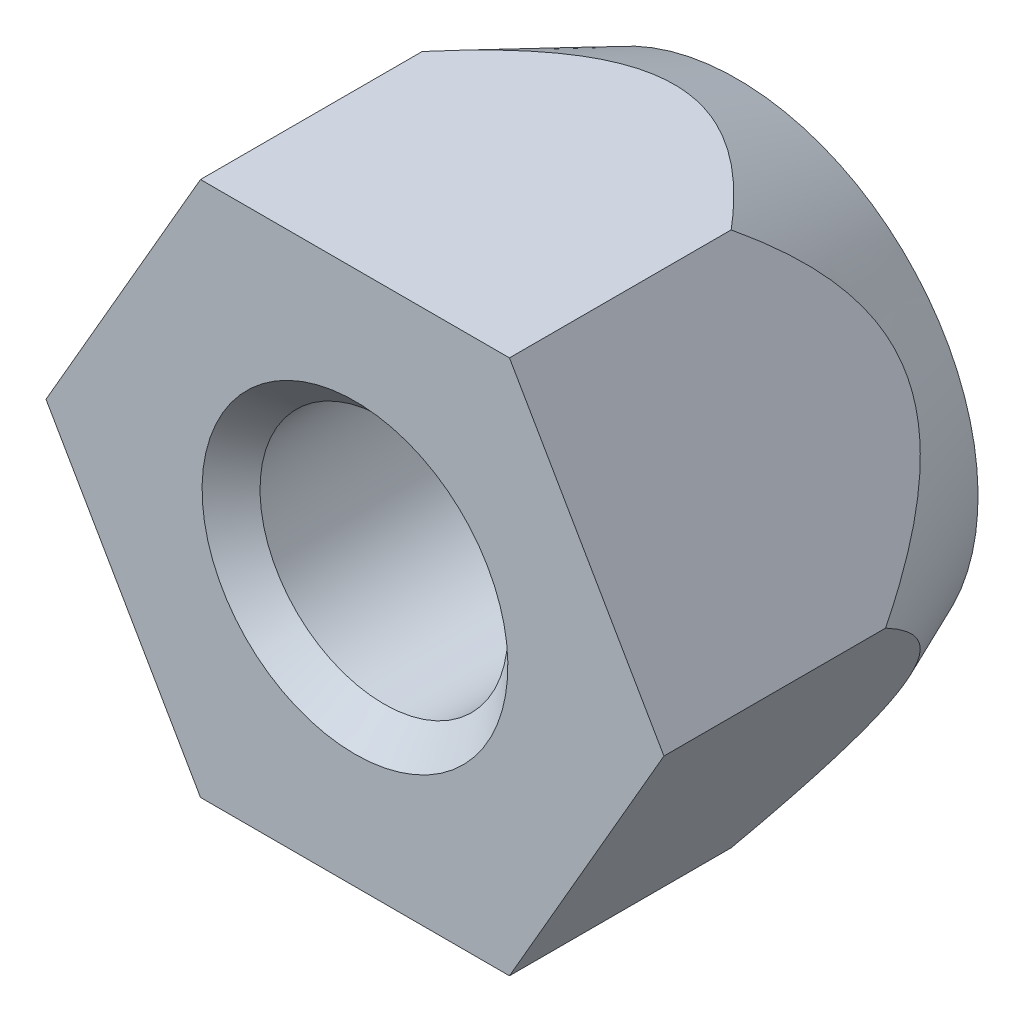
ISO-10303-21;
HEADER;
FILE_DESCRIPTION(('STEP AP214'),'2;1');
FILE_NAME('part.step','',(''),(''),'','','');
FILE_SCHEMA(('AUTOMOTIVE_DESIGN { 1 0 10303 214 1 1 1 1 }'));
ENDSEC;
DATA;
#1=APPLICATION_CONTEXT('core data for automotive mechanical design processes');
#2=APPLICATION_PROTOCOL_DEFINITION('international standard','automotive_design',2000,#1);
#3=PRODUCT_CONTEXT('',#1,'mechanical');
#4=PRODUCT('Part','Part','',(#3));
#5=PRODUCT_RELATED_PRODUCT_CATEGORY('part','',(#4));
#6=PRODUCT_DEFINITION_FORMATION('','',#4);
#7=PRODUCT_DEFINITION_CONTEXT('part definition',#1,'design');
#8=PRODUCT_DEFINITION('design','',#6,#7);
#9=PRODUCT_DEFINITION_SHAPE('','',#8);
#10=(LENGTH_UNIT() NAMED_UNIT(*) SI_UNIT(.MILLI.,.METRE.));
#11=(NAMED_UNIT(*) PLANE_ANGLE_UNIT() SI_UNIT($,.RADIAN.));
#12=(NAMED_UNIT(*) SI_UNIT($,.STERADIAN.) SOLID_ANGLE_UNIT());
#13=UNCERTAINTY_MEASURE_WITH_UNIT(LENGTH_MEASURE(1.E-05),#10,'distance_accuracy_value','');
#14=(GEOMETRIC_REPRESENTATION_CONTEXT(3) GLOBAL_UNCERTAINTY_ASSIGNED_CONTEXT((#13)) GLOBAL_UNIT_ASSIGNED_CONTEXT((#10,
#11,#12)) REPRESENTATION_CONTEXT('',''));
#15=CARTESIAN_POINT('',(0.,0.,0.));
#16=DIRECTION('',(0.,0.,1.));
#17=DIRECTION('',(1.,0.,0.));
#18=AXIS2_PLACEMENT_3D('',#15,#16,#17);
#19=CARTESIAN_POINT('',(2.020725,3.49999836812462,-5.));
#20=DIRECTION('',(-0.866025403784439,-0.5,0.));
#21=DIRECTION('',(-0.5,0.866025403784439,0.));
#22=AXIS2_PLACEMENT_3D('',#19,#20,#21);
#23=PLANE('',#22);
#24=CARTESIAN_POINT('',(2.02072415100027,3.49999983863529,-2.899998));
#25=CARTESIAN_POINT('',(2.04010619505648,3.46642915357538,-2.94565089198604));
#26=CARTESIAN_POINT('',(2.05972797870926,3.43244322735365,-2.99089538058564));
#27=CARTESIAN_POINT('',(2.09951636817217,3.36352771525255,-3.08043964962772));
#28=CARTESIAN_POINT('',(2.11968313958112,3.32859784254763,-3.12473913543784));
#29=CARTESIAN_POINT('',(2.18137903690977,3.22173741375586,-3.25662355142427));
#30=CARTESIAN_POINT('',(2.22382314177766,3.14822206764289,-3.3425250256382));
#31=CARTESIAN_POINT('',(2.31330340280759,2.99323770926453,-3.51108520230281));
#32=CARTESIAN_POINT('',(2.36045082518846,2.91157597825494,-3.59350980490269));
#33=CARTESIAN_POINT('',(2.45859776555435,2.74158049093379,-3.74825957928697));
#34=CARTESIAN_POINT('',(2.50958390481558,2.65326990725155,-3.82061753334812));
#35=CARTESIAN_POINT('',(2.58413071638398,2.52415104207282,-3.91138418798489));
#36=CARTESIAN_POINT('',(2.60577625263011,2.48665987353746,-3.93609856688412));
#37=CARTESIAN_POINT('',(2.64981771669924,2.41037782013,-3.98269921637913));
#38=CARTESIAN_POINT('',(2.67221375542195,2.37158674317399,-4.0045850666697));
#39=CARTESIAN_POINT('',(2.74021351541638,2.25380770396115,-4.06500160353191));
#40=CARTESIAN_POINT('',(2.78694805159032,2.17286111283971,-4.09869381707458));
#41=CARTESIAN_POINT('',(2.88351529794901,2.00560173579945,-4.14936341287786));
#42=CARTESIAN_POINT('',(2.93338565991639,1.9192237350801,-4.16606423215886));
#43=CARTESIAN_POINT('',(3.03382015506977,1.74526608664191,-4.17887532034338));
#44=CARTESIAN_POINT('',(3.0843842045817,1.65768658385082,-4.17498805122023));
#45=CARTESIAN_POINT('',(3.17672793087558,1.49774255814958,-4.14943762280108));
#46=CARTESIAN_POINT('',(3.21870698878445,1.42503269699754,-4.13046928708339));
#47=CARTESIAN_POINT('',(3.30079246575235,1.28285648032561,-4.0803675458512));
#48=CARTESIAN_POINT('',(3.34089735341767,1.21339277725744,-4.04922438028727));
#49=CARTESIAN_POINT('',(3.44767850687831,1.0284423941728,-3.9509167235984));
#50=CARTESIAN_POINT('',(3.51210926451756,0.91684504837146,-3.87413418471944));
#51=CARTESIAN_POINT('',(3.63499410872855,0.704002254717838,-3.7028033845824));
#52=CARTESIAN_POINT('',(3.69340829146907,0.602825922328652,-3.60814700557825));
#53=CARTESIAN_POINT('',(3.80217299392707,0.414439931601275,-3.41354195449901));
#54=CARTESIAN_POINT('',(3.85279151026634,0.326766089497905,-3.31418254961249));
#55=CARTESIAN_POINT('',(3.92575467101574,0.200390187999127,-3.16105796289514));
#56=CARTESIAN_POINT('',(3.94941263836739,0.159413386542265,-3.10974088500592));
#57=CARTESIAN_POINT('',(3.99597160075937,0.0787708981316793,-3.00579847017844));
#58=CARTESIAN_POINT('',(4.01887299253085,0.0391045240194299,-2.95317384509459));
#59=CARTESIAN_POINT('',(4.04145084899974,-1.47051067209862E-06,-2.899998));
#60=B_SPLINE_CURVE_WITH_KNOTS('',3,(#24,#25,#26,#27,#28,#29,#30,#31,#32,#33,#34,#35,#36,#37,#38,
#39,#40,#41,#42,#43,#44,#45,#46,#47,#48,#49,#50,#51,#52,#53,#54,#55,#56,#57,#58,#59),
.UNSPECIFIED.,.F.,.F.,(4,2,2,2,2,2,2,2,2,2,2,2,2,2,2,2,2,4),(0.,0.179663069809123,
0.35938135949057,0.721435633443099,1.09675416599678,1.47082032659827,1.62027619569909,
1.76975424772307,2.06646500543711,2.36793148056737,2.66936190642242,2.92651762715291,
3.18387992295865,3.63127257170363,4.08146358882315,4.50655577753209,4.71594032950862,
4.92521328355732),.UNSPECIFIED.);
#61=CARTESIAN_POINT('',(2.020725,3.49999836812462,-2.9));
#62=VERTEX_POINT('',#61);
#63=CARTESIAN_POINT('',(4.04145,0.,-2.9));
#64=VERTEX_POINT('',#63);
#65=EDGE_CURVE('E84',#62,#64,#60,.T.);
#66=ORIENTED_EDGE('',*,*,#65,.F.);
#67=DIRECTION('',(0.,0.,1.));
#68=VECTOR('',#67,1.);
#69=CARTESIAN_POINT('',(2.020725,3.49999836812462,-5.));
#70=LINE('',#69,#68);
#71=CARTESIAN_POINT('',(2.020725,3.49999836812462,0.));
#72=VERTEX_POINT('',#71);
#73=EDGE_CURVE('E69',#62,#72,#70,.T.);
#74=ORIENTED_EDGE('',*,*,#73,.T.);
#75=DIRECTION('',(0.5,-0.866025403784438,0.));
#76=VECTOR('',#75,1.);
#77=CARTESIAN_POINT('',(2.020725,3.49999836812462,0.));
#78=LINE('',#77,#76);
#79=CARTESIAN_POINT('',(4.04145,0.,0.));
#80=VERTEX_POINT('',#79);
#81=EDGE_CURVE('E87',#72,#80,#78,.T.);
#82=ORIENTED_EDGE('',*,*,#81,.T.);
#83=DIRECTION('',(0.,0.,1.));
#84=VECTOR('',#83,1.);
#85=CARTESIAN_POINT('',(4.04145,0.,-5.));
#86=LINE('',#85,#84);
#87=EDGE_CURVE('E11',#64,#80,#86,.T.);
#88=ORIENTED_EDGE('',*,*,#87,.F.);
#89=EDGE_LOOP('',(#66,#74,#82,#88));
#90=FACE_BOUND('',#89,.T.);
#91=ADVANCED_FACE('F16',(#90),#23,.F.);
#92=CARTESIAN_POINT('',(4.04145,0.,-5.));
#93=DIRECTION('',(-0.866025403784439,0.5,0.));
#94=DIRECTION('',(0.5,0.866025403784439,0.));
#95=AXIS2_PLACEMENT_3D('',#92,#93,#94);
#96=PLANE('',#95);
#97=CARTESIAN_POINT('',(4.04145084899974,1.47051067182888E-06,-2.899998));
#98=CARTESIAN_POINT('',(4.02206880494352,-0.033569214549235,-2.94565089198604));
#99=CARTESIAN_POINT('',(4.00244702129074,-0.0675551407709681,-2.99089538058564));
#100=CARTESIAN_POINT('',(3.96265863182783,-0.13647065287207,-3.08043964962772));
#101=CARTESIAN_POINT('',(3.94249186041888,-0.171400525576984,-3.12473913543784));
#102=CARTESIAN_POINT('',(3.88079596309024,-0.278260954368758,-3.25662355142427));
#103=CARTESIAN_POINT('',(3.83835185822234,-0.351776300481728,-3.3425250256382));
#104=CARTESIAN_POINT('',(3.74887159719242,-0.506760658860088,-3.5110852023028));
#105=CARTESIAN_POINT('',(3.70172417481154,-0.588422389869676,-3.59350980490269));
#106=CARTESIAN_POINT('',(3.60357723444565,-0.758417877190831,-3.74825957928697));
#107=CARTESIAN_POINT('',(3.55259109518442,-0.846728460873068,-3.82061753334811));
#108=CARTESIAN_POINT('',(3.47804428361602,-0.975847326051797,-3.91138418798489));
#109=CARTESIAN_POINT('',(3.45639874736989,-1.01333849458716,-3.93609856688411));
#110=CARTESIAN_POINT('',(3.41235728330076,-1.08962054799462,-3.98269921637913));
#111=CARTESIAN_POINT('',(3.38996124457805,-1.12841162495063,-4.0045850666697));
#112=CARTESIAN_POINT('',(3.32196148458362,-1.24619066416347,-4.06500160353191));
#113=CARTESIAN_POINT('',(3.27522694840968,-1.32713725528491,-4.09869381707458));
#114=CARTESIAN_POINT('',(3.17865970205099,-1.49439663232517,-4.14936341287786));
#115=CARTESIAN_POINT('',(3.12878934008361,-1.58077463304453,-4.16606423215886));
#116=CARTESIAN_POINT('',(3.02835484493023,-1.75473228148271,-4.17887532034337));
#117=CARTESIAN_POINT('',(2.97779079541831,-1.8423117842738,-4.17498805122022));
#118=CARTESIAN_POINT('',(2.88544706912442,-2.00225580997504,-4.14943762280108));
#119=CARTESIAN_POINT('',(2.84346801121555,-2.07496567112708,-4.13046928708339));
#120=CARTESIAN_POINT('',(2.76138253424765,-2.21714188779901,-4.0803675458512));
#121=CARTESIAN_POINT('',(2.72127764658233,-2.28660559086719,-4.04922438028727));
#122=CARTESIAN_POINT('',(2.61449649312169,-2.47155597395182,-3.9509167235984));
#123=CARTESIAN_POINT('',(2.55006573548244,-2.58315331975316,-3.87413418471944));
#124=CARTESIAN_POINT('',(2.42718089127145,-2.79599611340678,-3.7028033845824));
#125=CARTESIAN_POINT('',(2.36876670853093,-2.89717244579597,-3.60814700557825));
#126=CARTESIAN_POINT('',(2.26000200607293,-3.08555843652335,-3.413541954499));
#127=CARTESIAN_POINT('',(2.20938348973366,-3.17323227862672,-3.31418254961249));
#128=CARTESIAN_POINT('',(2.13642032898426,-3.29960818012549,-3.16105796289513));
#129=CARTESIAN_POINT('',(2.11276236163261,-3.34058498158236,-3.10974088500591));
#130=CARTESIAN_POINT('',(2.06620339924064,-3.42122746999294,-3.00579847017844));
#131=CARTESIAN_POINT('',(2.04330200746915,-3.46089384410519,-2.95317384509459));
#132=CARTESIAN_POINT('',(2.02072415100027,-3.49999983863529,-2.899998));
#133=B_SPLINE_CURVE_WITH_KNOTS('',3,(#97,#98,#99,#100,#101,#102,#103,#104,#105,#106,#107,#108,
#109,#110,#111,#112,#113,#114,#115,#116,#117,#118,#119,#120,#121,#122,#123,#124,#125,#126,#127,
#128,#129,#130,#131,#132),.UNSPECIFIED.,.F.,.F.,(4,2,2,2,2,2,2,2,2,2,2,2,2,2,2,2,2,4),(0.,
0.179663069809122,0.359381359490568,0.721435633443094,1.09675416599677,1.47082032659826,
1.62027619569909,1.76975424772307,2.06646500543711,2.36793148056737,2.66936190642242,
2.92651762715291,3.18387992295865,3.63127257170363,4.08146358882316,4.50655577753209,
4.71594032950862,4.92521328355731),.UNSPECIFIED.);
#134=CARTESIAN_POINT('',(2.020725,-3.49999836812462,-2.9));
#135=VERTEX_POINT('',#134);
#136=EDGE_CURVE('E31',#64,#135,#133,.T.);
#137=ORIENTED_EDGE('',*,*,#136,.F.);
#138=ORIENTED_EDGE('',*,*,#87,.T.);
#139=DIRECTION('',(-0.5,-0.866025403784439,0.));
#140=VECTOR('',#139,1.);
#141=CARTESIAN_POINT('',(4.04145,0.,0.));
#142=LINE('',#141,#140);
#143=CARTESIAN_POINT('',(2.020725,-3.49999836812462,0.));
#144=VERTEX_POINT('',#143);
#145=EDGE_CURVE('E299',#80,#144,#142,.T.);
#146=ORIENTED_EDGE('',*,*,#145,.T.);
#147=DIRECTION('',(0.,0.,1.));
#148=VECTOR('',#147,1.);
#149=CARTESIAN_POINT('',(2.020725,-3.49999836812462,-5.));
#150=LINE('',#149,#148);
#151=EDGE_CURVE('E25',#135,#144,#150,.T.);
#152=ORIENTED_EDGE('',*,*,#151,.F.);
#153=EDGE_LOOP('',(#137,#138,#146,#152));
#154=FACE_BOUND('',#153,.T.);
#155=ADVANCED_FACE('F152',(#154),#96,.F.);
#156=CARTESIAN_POINT('',(2.020725,-3.49999836812462,-5.));
#157=DIRECTION('',(0.,1.,0.));
#158=DIRECTION('',(1.,0.,0.));
#159=AXIS2_PLACEMENT_3D('',#156,#157,#158);
#160=PLANE('',#159);
#161=CARTESIAN_POINT('',(-3.60368526524227,-3.49999836812462,-0.586341765384487));
#162=CARTESIAN_POINT('',(-3.53187011337455,-3.49999836812462,-0.707671007586551));
#163=CARTESIAN_POINT('',(-3.45930512100524,-3.49999836812462,-0.828563242155586));
#164=CARTESIAN_POINT('',(-3.31235058980913,-3.49999836812462,-1.0692758727666));
#165=CARTESIAN_POINT('',(-3.23796057927049,-3.49999836812462,-1.18909598053858));
#166=CARTESIAN_POINT('',(-3.08628396302446,-3.49999836812462,-1.42864169720031));
#167=CARTESIAN_POINT('',(-3.00897528326545,-3.49999836812462,-1.54835337221099));
#168=CARTESIAN_POINT('',(-2.85178904394115,-3.49999836812462,-1.78606201635112));
#169=CARTESIAN_POINT('',(-2.77191179701828,-3.49999836812462,-1.9040591916477));
#170=CARTESIAN_POINT('',(-2.60287228799337,-3.49999836812462,-2.14675103457604));
#171=CARTESIAN_POINT('',(-2.51346505080088,-3.49999836812462,-2.27127586614559));
#172=CARTESIAN_POINT('',(-2.33016750965945,-3.49999836812462,-2.51697643964741));
#173=CARTESIAN_POINT('',(-2.23627790694638,-3.49999836812462,-2.63815270078827));
#174=CARTESIAN_POINT('',(-2.04320133293011,-3.49999836812462,-2.87538165544638));
#175=CARTESIAN_POINT('',(-1.94403858894009,-3.49999836812462,-2.99145394720864));
#176=CARTESIAN_POINT('',(-1.73846289891875,-3.49999836812462,-3.21694004890755));
#177=CARTESIAN_POINT('',(-1.63205684142847,-3.49999836812462,-3.3263600028976));
#178=CARTESIAN_POINT('',(-1.46743226257282,-3.49999836812462,-3.480894093348));
#179=CARTESIAN_POINT('',(-1.4128729663633,-3.49999836812462,-3.52990400877336));
#180=CARTESIAN_POINT('',(-1.30120959285346,-3.49999836812462,-3.62500160684067));
#181=CARTESIAN_POINT('',(-1.24410452421649,-3.49999836812462,-3.67108813387286));
#182=CARTESIAN_POINT('',(-1.12747539014198,-3.49999836812462,-3.75923350088157));
#183=CARTESIAN_POINT('',(-1.0679713424504,-3.49999836812462,-3.80131857681453));
#184=CARTESIAN_POINT('',(-0.945936136039932,-3.49999836812462,-3.88080225842855));
#185=CARTESIAN_POINT('',(-0.883406457103035,-3.49999836812462,-3.91820312358852));
#186=CARTESIAN_POINT('',(-0.733695889558256,-3.49999836812462,-3.99857848370267));
#187=CARTESIAN_POINT('',(-0.645243338631821,-3.49999836812462,-4.03925785736186));
#188=CARTESIAN_POINT('',(-0.46304537990612,-3.49999836812462,-4.1063494028999));
#189=CARTESIAN_POINT('',(-0.369306884608134,-3.49999836812462,-4.13277975147609));
#190=CARTESIAN_POINT('',(-0.177364649800885,-3.49999836812462,-4.16801952991906));
#191=CARTESIAN_POINT('',(-0.0791233994873151,-3.49999836812462,-4.176633926494));
#192=CARTESIAN_POINT('',(0.117089626236598,-3.49999836812462,-4.17413239831532));
#193=CARTESIAN_POINT('',(0.215061401328386,-3.49999836812462,-4.16301645024786));
#194=CARTESIAN_POINT('',(0.414073332498433,-3.49999836812462,-4.12153407679946));
#195=CARTESIAN_POINT('',(0.514825219562708,-3.49999836812462,-4.08983715525037));
#196=CARTESIAN_POINT('',(0.709924351166737,-3.49999836812462,-4.01067455757774));
#197=CARTESIAN_POINT('',(0.804257066515896,-3.49999836812462,-3.96317445468344));
#198=CARTESIAN_POINT('',(0.975268221233125,-3.49999836812462,-3.863346961346));
#199=CARTESIAN_POINT('',(1.05270629201837,-3.49999836812462,-3.81228444121548));
#200=CARTESIAN_POINT('',(1.20297308465852,-3.49999836812462,-3.7037169597727));
#201=CARTESIAN_POINT('',(1.27579768520735,-3.49999836812462,-3.64620636181361));
#202=CARTESIAN_POINT('',(1.41803135877625,-3.49999836812462,-3.5258912132412));
#203=CARTESIAN_POINT('',(1.48740320181263,-3.49999836812462,-3.46304314440494));
#204=CARTESIAN_POINT('',(1.6225958566662,-3.49999836812462,-3.33373383579426));
#205=CARTESIAN_POINT('',(1.68841851117596,-3.49999836812462,-3.26727450763575));
#206=CARTESIAN_POINT('',(1.81700595547463,-3.49999836812462,-3.13163620785443));
#207=CARTESIAN_POINT('',(1.87977450495097,-3.49999836812462,-3.06246077975415));
#208=CARTESIAN_POINT('',(2.00279018813071,-3.49999836812462,-2.92189708639954));
#209=CARTESIAN_POINT('',(2.06303695646089,-3.49999836812462,-2.85050850307813));
#210=CARTESIAN_POINT('',(2.24063099376073,-3.49999836812462,-2.63361809244465));
#211=CARTESIAN_POINT('',(2.35475333849329,-3.49999836812462,-2.48547681041738));
#212=CARTESIAN_POINT('',(2.57698061887582,-3.49999836812462,-2.18396024625559));
#213=CARTESIAN_POINT('',(2.68506150861361,-3.49999836812462,-2.03056749443956));
#214=CARTESIAN_POINT('',(2.89626535994594,-3.49999836812462,-1.72039071423693));
#215=CARTESIAN_POINT('',(2.99938768028773,-3.49999836812462,-1.56360625100796));
#216=CARTESIAN_POINT('',(3.19328398781423,-3.49999836812462,-1.26071939303122));
#217=CARTESIAN_POINT('',(3.28437072229164,-3.49999836812462,-1.11481609600272));
#218=CARTESIAN_POINT('',(3.46386325248297,-3.49999836812462,-0.821351061873757));
#219=CARTESIAN_POINT('',(3.5522687535352,-3.49999836812462,-0.673789144919471));
#220=CARTESIAN_POINT('',(3.7260836217544,-3.49999836812462,-0.378658774351413));
#221=CARTESIAN_POINT('',(3.81151249076131,-3.49999836812462,-0.231101772932865));
#222=CARTESIAN_POINT('',(3.98049352146154,-3.49999836812462,0.0650422170049673));
#223=CARTESIAN_POINT('',(4.06404607918504,-3.49999836812462,0.213628979343102));
#224=CARTESIAN_POINT('',(4.14683525622261,-3.49999836812462,0.362634088527305));
#225=B_SPLINE_CURVE_WITH_KNOTS('',3,(#161,#162,#163,#164,#165,#166,#167,#168,#169,#170,#171,
#172,#173,#174,#175,#176,#177,#178,#179,#180,#181,#182,#183,#184,#185,#186,#187,#188,#189,#190,
#191,#192,#193,#194,#195,#196,#197,#198,#199,#200,#201,#202,#203,#204,#205,#206,#207,#208,#209,
#210,#211,#212,#213,#214,#215,#216,#217,#218,#219,#220,#221,#222,#223,#224),.UNSPECIFIED.,.F.,
.F.,(4,2,2,2,2,2,2,2,2,2,2,2,2,2,2,2,2,2,2,2,2,2,2,2,2,2,2,2,2,2,2,4),(0.,0.422976271321654,
0.846063045608591,1.27354850699133,1.70098213093986,2.16079751984572,2.62054120796517,
3.07832965681675,3.53568866293405,3.7556275635951,3.9756528707344,4.19411843727798,
4.41247821541922,4.70359464689231,4.99433883312471,5.28824933629446,5.58216018675596,
5.89726737249627,6.21306555463387,6.49093693682409,6.7690531450872,7.04970713497514,
7.3302139814798,7.61036629536475,7.89055906015058,8.45129183713974,9.01411722522584,
9.57701520440341,10.0929872032773,10.6090157023741,11.1205096010261,11.6318945049628),.UNSPECIFIED.);
#226=CARTESIAN_POINT('',(-2.020725,-3.49999836812462,-2.9));
#227=VERTEX_POINT('',#226);
#228=EDGE_CURVE('E39',#135,#227,#225,.F.);
#229=ORIENTED_EDGE('',*,*,#228,.F.);
#230=ORIENTED_EDGE('',*,*,#151,.T.);
#231=DIRECTION('',(-1.,0.,0.));
#232=VECTOR('',#231,1.);
#233=CARTESIAN_POINT('',(2.020725,-3.49999836812462,0.));
#234=LINE('',#233,#232);
#235=CARTESIAN_POINT('',(-2.020725,-3.49999836812462,0.));
#236=VERTEX_POINT('',#235);
#237=EDGE_CURVE('E315',#144,#236,#234,.T.);
#238=ORIENTED_EDGE('',*,*,#237,.T.);
#239=DIRECTION('',(0.,0.,1.));
#240=VECTOR('',#239,1.);
#241=CARTESIAN_POINT('',(-2.020725,-3.49999836812462,-5.));
#242=LINE('',#241,#240);
#243=EDGE_CURVE('E306',#227,#236,#242,.T.);
#244=ORIENTED_EDGE('',*,*,#243,.F.);
#245=EDGE_LOOP('',(#229,#230,#238,#244));
#246=FACE_BOUND('',#245,.T.);
#247=ADVANCED_FACE('F155',(#246),#160,.F.);
#248=CARTESIAN_POINT('',(-2.020725,-3.49999836812462,-5.));
#249=DIRECTION('',(0.866025403784439,0.5,0.));
#250=DIRECTION('',(0.5,-0.866025403784439,0.));
#251=AXIS2_PLACEMENT_3D('',#248,#249,#250);
#252=PLANE('',#251);
#253=CARTESIAN_POINT('',(-2.02072415100027,-3.49999983863529,-2.899998));
#254=CARTESIAN_POINT('',(-2.04010619505648,-3.46642915357539,-2.94565089198604));
#255=CARTESIAN_POINT('',(-2.05972797870926,-3.43244322735365,-2.99089538058564));
#256=CARTESIAN_POINT('',(-2.09951636817217,-3.36352771525255,-3.08043964962772));
#257=CARTESIAN_POINT('',(-2.11968313958111,-3.32859784254764,-3.12473913543784));
#258=CARTESIAN_POINT('',(-2.18137903690976,-3.22173741375586,-3.25662355142427));
#259=CARTESIAN_POINT('',(-2.22382314177766,-3.14822206764289,-3.3425250256382));
#260=CARTESIAN_POINT('',(-2.31330340280758,-2.99323770926453,-3.51108520230281));
#261=CARTESIAN_POINT('',(-2.36045082518846,-2.91157597825494,-3.59350980490269));
#262=CARTESIAN_POINT('',(-2.45859776555435,-2.74158049093379,-3.74825957928697));
#263=CARTESIAN_POINT('',(-2.50958390481558,-2.65326990725155,-3.82061753334811));
#264=CARTESIAN_POINT('',(-2.58413071638398,-2.52415104207282,-3.91138418798489));
#265=CARTESIAN_POINT('',(-2.60577625263011,-2.48665987353746,-3.93609856688412));
#266=CARTESIAN_POINT('',(-2.64981771669924,-2.41037782013,-3.98269921637913));
#267=CARTESIAN_POINT('',(-2.67221375542195,-2.37158674317399,-4.0045850666697));
#268=CARTESIAN_POINT('',(-2.74021351541638,-2.25380770396115,-4.06500160353191));
#269=CARTESIAN_POINT('',(-2.78694805159032,-2.17286111283971,-4.09869381707458));
#270=CARTESIAN_POINT('',(-2.88351529794901,-2.00560173579945,-4.14936341287786));
#271=CARTESIAN_POINT('',(-2.93338565991639,-1.9192237350801,-4.16606423215886));
#272=CARTESIAN_POINT('',(-3.03382015506977,-1.74526608664191,-4.17887532034337));
#273=CARTESIAN_POINT('',(-3.0843842045817,-1.65768658385082,-4.17498805122023));
#274=CARTESIAN_POINT('',(-3.17672793087558,-1.49774255814958,-4.14943762280108));
#275=CARTESIAN_POINT('',(-3.21870698878445,-1.42503269699754,-4.1304692870834));
#276=CARTESIAN_POINT('',(-3.30079246575235,-1.28285648032561,-4.0803675458512));
#277=CARTESIAN_POINT('',(-3.34089735341767,-1.21339277725744,-4.04922438028727));
#278=CARTESIAN_POINT('',(-3.44767850687831,-1.0284423941728,-3.9509167235984));
#279=CARTESIAN_POINT('',(-3.51210926451756,-0.916845048371458,-3.87413418471944));
#280=CARTESIAN_POINT('',(-3.63499410872855,-0.704002254717838,-3.7028033845824));
#281=CARTESIAN_POINT('',(-3.69340829146907,-0.602825922328654,-3.60814700557825));
#282=CARTESIAN_POINT('',(-3.80217299392707,-0.414439931601277,-3.41354195449901));
#283=CARTESIAN_POINT('',(-3.85279151026634,-0.326766089497906,-3.31418254961249));
#284=CARTESIAN_POINT('',(-3.92575467101574,-0.200390187999127,-3.16105796289514));
#285=CARTESIAN_POINT('',(-3.94941263836739,-0.159413386542265,-3.10974088500592));
#286=CARTESIAN_POINT('',(-3.99597160075937,-0.0787708981316799,-3.00579847017844));
#287=CARTESIAN_POINT('',(-4.01887299253085,-0.0391045240194304,-2.95317384509459));
#288=CARTESIAN_POINT('',(-4.04145084899974,1.47051067182122E-06,-2.899998));
#289=B_SPLINE_CURVE_WITH_KNOTS('',3,(#253,#254,#255,#256,#257,#258,#259,#260,#261,#262,#263,
#264,#265,#266,#267,#268,#269,#270,#271,#272,#273,#274,#275,#276,#277,#278,#279,#280,#281,#282,
#283,#284,#285,#286,#287,#288),.UNSPECIFIED.,.F.,.F.,(4,2,2,2,2,2,2,2,2,2,2,2,2,2,2,2,2,4),(0.,
0.179663069809123,0.359381359490569,0.721435633443097,1.09675416599677,1.47082032659827,
1.62027619569909,1.76975424772308,2.06646500543711,2.36793148056738,2.66936190642243,
2.92651762715292,3.18387992295865,3.63127257170363,4.08146358882316,4.50655577753209,
4.71594032950862,4.92521328355732),.UNSPECIFIED.);
#290=CARTESIAN_POINT('',(-4.04145,0.,-2.9));
#291=VERTEX_POINT('',#290);
#292=EDGE_CURVE('E101',#227,#291,#289,.T.);
#293=ORIENTED_EDGE('',*,*,#292,.F.);
#294=ORIENTED_EDGE('',*,*,#243,.T.);
#295=DIRECTION('',(-0.5,0.866025403784439,0.));
#296=VECTOR('',#295,1.);
#297=CARTESIAN_POINT('',(-2.020725,-3.49999836812462,0.));
#298=LINE('',#297,#296);
#299=CARTESIAN_POINT('',(-4.04145,0.,0.));
#300=VERTEX_POINT('',#299);
#301=EDGE_CURVE('E294',#236,#300,#298,.T.);
#302=ORIENTED_EDGE('',*,*,#301,.T.);
#303=DIRECTION('',(0.,0.,1.));
#304=VECTOR('',#303,1.);
#305=CARTESIAN_POINT('',(-4.04145,0.,-5.));
#306=LINE('',#305,#304);
#307=EDGE_CURVE('E303',#291,#300,#306,.T.);
#308=ORIENTED_EDGE('',*,*,#307,.F.);
#309=EDGE_LOOP('',(#293,#294,#302,#308));
#310=FACE_BOUND('',#309,.T.);
#311=ADVANCED_FACE('F158',(#310),#252,.F.);
#312=CARTESIAN_POINT('',(-4.04145,0.,-5.));
#313=DIRECTION('',(0.866025403784439,-0.5,0.));
#314=DIRECTION('',(-0.5,-0.866025403784439,0.));
#315=AXIS2_PLACEMENT_3D('',#312,#313,#314);
#316=PLANE('',#315);
#317=CARTESIAN_POINT('',(-4.04145084899974,-1.47051067303407E-06,-2.899998));
#318=CARTESIAN_POINT('',(-4.02206880494352,0.033569214549234,-2.94565089198604));
#319=CARTESIAN_POINT('',(-4.00244702129074,0.0675551407709672,-2.99089538058564));
#320=CARTESIAN_POINT('',(-3.96265863182783,0.136470652872069,-3.08043964962772));
#321=CARTESIAN_POINT('',(-3.94249186041888,0.171400525576983,-3.12473913543784));
#322=CARTESIAN_POINT('',(-3.88079596309024,0.278260954368758,-3.25662355142427));
#323=CARTESIAN_POINT('',(-3.83835185822234,0.351776300481727,-3.3425250256382));
#324=CARTESIAN_POINT('',(-3.74887159719242,0.506760658860088,-3.51108520230281));
#325=CARTESIAN_POINT('',(-3.70172417481154,0.588422389869675,-3.59350980490269));
#326=CARTESIAN_POINT('',(-3.60357723444565,0.75841787719083,-3.74825957928697));
#327=CARTESIAN_POINT('',(-3.55259109518442,0.846728460873068,-3.82061753334811));
#328=CARTESIAN_POINT('',(-3.47804428361602,0.975847326051796,-3.91138418798489));
#329=CARTESIAN_POINT('',(-3.45639874736989,1.01333849458716,-3.93609856688412));
#330=CARTESIAN_POINT('',(-3.41235728330076,1.08962054799462,-3.98269921637913));
#331=CARTESIAN_POINT('',(-3.38996124457805,1.12841162495063,-4.0045850666697));
#332=CARTESIAN_POINT('',(-3.32196148458362,1.24619066416347,-4.06500160353191));
#333=CARTESIAN_POINT('',(-3.27522694840968,1.32713725528491,-4.09869381707458));
#334=CARTESIAN_POINT('',(-3.17865970205099,1.49439663232517,-4.14936341287786));
#335=CARTESIAN_POINT('',(-3.12878934008361,1.58077463304453,-4.16606423215887));
#336=CARTESIAN_POINT('',(-3.02835484493023,1.75473228148271,-4.17887532034337));
#337=CARTESIAN_POINT('',(-2.97779079541831,1.8423117842738,-4.17498805122022));
#338=CARTESIAN_POINT('',(-2.88544706912442,2.00225580997504,-4.14943762280108));
#339=CARTESIAN_POINT('',(-2.84346801121555,2.07496567112708,-4.13046928708339));
#340=CARTESIAN_POINT('',(-2.76138253424765,2.21714188779901,-4.08036754585119));
#341=CARTESIAN_POINT('',(-2.72127764658233,2.28660559086719,-4.04922438028727));
#342=CARTESIAN_POINT('',(-2.61449649312169,2.47155597395182,-3.95091672359839));
#343=CARTESIAN_POINT('',(-2.55006573548243,2.58315331975316,-3.87413418471944));
#344=CARTESIAN_POINT('',(-2.42718089127145,2.79599611340679,-3.7028033845824));
#345=CARTESIAN_POINT('',(-2.36876670853093,2.89717244579597,-3.60814700557825));
#346=CARTESIAN_POINT('',(-2.26000200607293,3.08555843652335,-3.413541954499));
#347=CARTESIAN_POINT('',(-2.20938348973366,3.17323227862672,-3.31418254961249));
#348=CARTESIAN_POINT('',(-2.13642032898426,3.29960818012549,-3.16105796289514));
#349=CARTESIAN_POINT('',(-2.11276236163261,3.34058498158235,-3.10974088500591));
#350=CARTESIAN_POINT('',(-2.06620339924064,3.42122746999294,-3.00579847017844));
#351=CARTESIAN_POINT('',(-2.04330200746915,3.46089384410519,-2.95317384509459));
#352=CARTESIAN_POINT('',(-2.02072415100027,3.49999983863529,-2.899998));
#353=B_SPLINE_CURVE_WITH_KNOTS('',3,(#317,#318,#319,#320,#321,#322,#323,#324,#325,#326,#327,
#328,#329,#330,#331,#332,#333,#334,#335,#336,#337,#338,#339,#340,#341,#342,#343,#344,#345,#346,
#347,#348,#349,#350,#351,#352),.UNSPECIFIED.,.F.,.F.,(4,2,2,2,2,2,2,2,2,2,2,2,2,2,2,2,2,4),(0.,
0.179663069809123,0.359381359490568,0.721435633443095,1.09675416599677,1.47082032659826,
1.62027619569909,1.76975424772308,2.06646500543711,2.36793148056738,2.66936190642243,
2.92651762715292,3.18387992295865,3.63127257170363,4.08146358882316,4.50655577753209,
4.71594032950862,4.92521328355731),.UNSPECIFIED.);
#354=CARTESIAN_POINT('',(-2.020725,3.49999836812462,-2.9));
#355=VERTEX_POINT('',#354);
#356=EDGE_CURVE('E92',#291,#355,#353,.T.);
#357=ORIENTED_EDGE('',*,*,#356,.F.);
#358=ORIENTED_EDGE('',*,*,#307,.T.);
#359=DIRECTION('',(0.5,0.866025403784439,0.));
#360=VECTOR('',#359,1.);
#361=CARTESIAN_POINT('',(-4.04145,0.,0.));
#362=LINE('',#361,#360);
#363=CARTESIAN_POINT('',(-2.020725,3.49999836812462,0.));
#364=VERTEX_POINT('',#363);
#365=EDGE_CURVE('E290',#300,#364,#362,.T.);
#366=ORIENTED_EDGE('',*,*,#365,.T.);
#367=DIRECTION('',(0.,0.,1.));
#368=VECTOR('',#367,1.);
#369=CARTESIAN_POINT('',(-2.020725,3.49999836812462,-5.));
#370=LINE('',#369,#368);
#371=EDGE_CURVE('E81',#355,#364,#370,.T.);
#372=ORIENTED_EDGE('',*,*,#371,.F.);
#373=EDGE_LOOP('',(#357,#358,#366,#372));
#374=FACE_BOUND('',#373,.T.);
#375=ADVANCED_FACE('F161',(#374),#316,.F.);
#376=CARTESIAN_POINT('',(-2.020725,3.49999836812462,-5.));
#377=DIRECTION('',(0.,-1.,0.));
#378=DIRECTION('',(-1.,0.,0.));
#379=AXIS2_PLACEMENT_3D('',#376,#377,#378);
#380=PLANE('',#379);
#381=CARTESIAN_POINT('',(-3.60368526524227,3.49999836812462,-0.586341765384491));
#382=CARTESIAN_POINT('',(-3.53187011337455,3.49999836812462,-0.707671007586554));
#383=CARTESIAN_POINT('',(-3.45930512100524,3.49999836812462,-0.828563242155588));
#384=CARTESIAN_POINT('',(-3.31235058980913,3.49999836812462,-1.06927587276661));
#385=CARTESIAN_POINT('',(-3.23796057927049,3.49999836812462,-1.18909598053858));
#386=CARTESIAN_POINT('',(-3.08628396302446,3.49999836812462,-1.42864169720031));
#387=CARTESIAN_POINT('',(-3.00897528326545,3.49999836812462,-1.548353372211));
#388=CARTESIAN_POINT('',(-2.85178904394115,3.49999836812462,-1.78606201635112));
#389=CARTESIAN_POINT('',(-2.77191179701828,3.49999836812462,-1.90405919164771));
#390=CARTESIAN_POINT('',(-2.60287228799337,3.49999836812462,-2.14675103457604));
#391=CARTESIAN_POINT('',(-2.51346505080088,3.49999836812462,-2.2712758661456));
#392=CARTESIAN_POINT('',(-2.33016750965945,3.49999836812462,-2.51697643964741));
#393=CARTESIAN_POINT('',(-2.23627790694637,3.49999836812462,-2.63815270078827));
#394=CARTESIAN_POINT('',(-2.04320133293011,3.49999836812462,-2.87538165544638));
#395=CARTESIAN_POINT('',(-1.94403858894008,3.49999836812462,-2.99145394720864));
#396=CARTESIAN_POINT('',(-1.73846289891875,3.49999836812462,-3.21694004890756));
#397=CARTESIAN_POINT('',(-1.63205684142848,3.49999836812462,-3.3263600028976));
#398=CARTESIAN_POINT('',(-1.46743226257283,3.49999836812462,-3.480894093348));
#399=CARTESIAN_POINT('',(-1.4128729663633,3.49999836812462,-3.52990400877336));
#400=CARTESIAN_POINT('',(-1.30120959285346,3.49999836812462,-3.62500160684067));
#401=CARTESIAN_POINT('',(-1.24410452421649,3.49999836812462,-3.67108813387285));
#402=CARTESIAN_POINT('',(-1.12747539014198,3.49999836812462,-3.75923350088156));
#403=CARTESIAN_POINT('',(-1.06797134245041,3.49999836812462,-3.80131857681452));
#404=CARTESIAN_POINT('',(-0.945936136039933,3.49999836812462,-3.88080225842855));
#405=CARTESIAN_POINT('',(-0.883406457103037,3.49999836812462,-3.91820312358852));
#406=CARTESIAN_POINT('',(-0.733695889558258,3.49999836812462,-3.99857848370267));
#407=CARTESIAN_POINT('',(-0.645243338631821,3.49999836812462,-4.03925785736186));
#408=CARTESIAN_POINT('',(-0.46304537990612,3.49999836812462,-4.1063494028999));
#409=CARTESIAN_POINT('',(-0.369306884608135,3.49999836812462,-4.1327797514761));
#410=CARTESIAN_POINT('',(-0.177364649800888,3.49999836812462,-4.16801952991906));
#411=CARTESIAN_POINT('',(-0.0791233994873169,3.49999836812462,-4.17663392649399));
#412=CARTESIAN_POINT('',(0.117089626236597,3.49999836812462,-4.17413239831531));
#413=CARTESIAN_POINT('',(0.215061401328385,3.49999836812462,-4.16301645024786));
#414=CARTESIAN_POINT('',(0.414073332498432,3.49999836812462,-4.12153407679946));
#415=CARTESIAN_POINT('',(0.514825219562706,3.49999836812462,-4.08983715525037));
#416=CARTESIAN_POINT('',(0.709924351166735,3.49999836812462,-4.01067455757774));
#417=CARTESIAN_POINT('',(0.804257066515896,3.49999836812462,-3.96317445468343));
#418=CARTESIAN_POINT('',(0.975268221233125,3.49999836812462,-3.863346961346));
#419=CARTESIAN_POINT('',(1.05270629201837,3.49999836812462,-3.81228444121547));
#420=CARTESIAN_POINT('',(1.20297308465851,3.49999836812462,-3.7037169597727));
#421=CARTESIAN_POINT('',(1.27579768520735,3.49999836812462,-3.64620636181361));
#422=CARTESIAN_POINT('',(1.41803135877624,3.49999836812462,-3.5258912132412));
#423=CARTESIAN_POINT('',(1.48740320181263,3.49999836812462,-3.46304314440494));
#424=CARTESIAN_POINT('',(1.6225958566662,3.49999836812462,-3.33373383579425));
#425=CARTESIAN_POINT('',(1.68841851117596,3.49999836812462,-3.26727450763575));
#426=CARTESIAN_POINT('',(1.81700595547463,3.49999836812462,-3.13163620785442));
#427=CARTESIAN_POINT('',(1.87977450495097,3.49999836812462,-3.06246077975414));
#428=CARTESIAN_POINT('',(2.00279018813071,3.49999836812462,-2.92189708639953));
#429=CARTESIAN_POINT('',(2.06303695646089,3.49999836812462,-2.85050850307812));
#430=CARTESIAN_POINT('',(2.24063099376074,3.49999836812462,-2.63361809244463));
#431=CARTESIAN_POINT('',(2.35475333849329,3.49999836812462,-2.48547681041737));
#432=CARTESIAN_POINT('',(2.57698061887582,3.49999836812462,-2.18396024625557));
#433=CARTESIAN_POINT('',(2.68506150861361,3.49999836812462,-2.03056749443954));
#434=CARTESIAN_POINT('',(2.89626535994594,3.49999836812462,-1.72039071423691));
#435=CARTESIAN_POINT('',(2.99938768028774,3.49999836812462,-1.56360625100794));
#436=CARTESIAN_POINT('',(3.19328398781424,3.49999836812462,-1.2607193930312));
#437=CARTESIAN_POINT('',(3.28437072229165,3.49999836812462,-1.11481609600269));
#438=CARTESIAN_POINT('',(3.46386325248298,3.49999836812462,-0.821351061873734));
#439=CARTESIAN_POINT('',(3.55226875353521,3.49999836812462,-0.673789144919447));
#440=CARTESIAN_POINT('',(3.72608362175441,3.49999836812462,-0.378658774351387));
#441=CARTESIAN_POINT('',(3.81151249076132,3.49999836812462,-0.231101772932838));
#442=CARTESIAN_POINT('',(3.98049352146155,3.49999836812462,0.0650422170049943));
#443=CARTESIAN_POINT('',(4.06404607918506,3.49999836812462,0.213628979343128));
#444=CARTESIAN_POINT('',(4.14683525622263,3.49999836812463,0.362634088527331));
#445=B_SPLINE_CURVE_WITH_KNOTS('',3,(#381,#382,#383,#384,#385,#386,#387,#388,#389,#390,#391,
#392,#393,#394,#395,#396,#397,#398,#399,#400,#401,#402,#403,#404,#405,#406,#407,#408,#409,#410,
#411,#412,#413,#414,#415,#416,#417,#418,#419,#420,#421,#422,#423,#424,#425,#426,#427,#428,#429,
#430,#431,#432,#433,#434,#435,#436,#437,#438,#439,#440,#441,#442,#443,#444),.UNSPECIFIED.,.F.,
.F.,(4,2,2,2,2,2,2,2,2,2,2,2,2,2,2,2,2,2,2,2,2,2,2,2,2,2,2,2,2,2,2,4),(0.,0.422976271321654,
0.846063045608593,1.27354850699133,1.70098213093987,2.16079751984572,2.62054120796518,
3.07832965681675,3.53568866293405,3.7556275635951,3.9756528707344,4.19411843727797,
4.41247821541921,4.70359464689231,4.99433883312471,5.28824933629446,5.58216018675596,
5.89726737249627,6.21306555463387,6.49093693682409,6.7690531450872,7.04970713497514,
7.3302139814798,7.61036629536475,7.89055906015058,8.45129183713974,9.01411722522586,
9.57701520440343,10.0929872032773,10.6090157023741,11.1205096010261,11.6318945049628),.UNSPECIFIED.);
#446=EDGE_CURVE('E73',#355,#62,#445,.T.);
#447=ORIENTED_EDGE('',*,*,#446,.F.);
#448=ORIENTED_EDGE('',*,*,#371,.T.);
#449=DIRECTION('',(1.,0.,0.));
#450=VECTOR('',#449,1.);
#451=CARTESIAN_POINT('',(-2.020725,3.49999836812462,0.));
#452=LINE('',#451,#450);
#453=EDGE_CURVE('E76',#364,#72,#452,.T.);
#454=ORIENTED_EDGE('',*,*,#453,.T.);
#455=ORIENTED_EDGE('',*,*,#73,.F.);
#456=EDGE_LOOP('',(#447,#448,#454,#455));
#457=FACE_BOUND('',#456,.T.);
#458=ADVANCED_FACE('F71',(#457),#380,.F.);
#459=CARTESIAN_POINT('',(4.04145,0.,0.));
#460=DIRECTION('',(0.,0.,-1.));
#461=DIRECTION('',(1.,0.,0.));
#462=AXIS2_PLACEMENT_3D('',#459,#460,#461);
#463=PLANE('',#462);
#464=CARTESIAN_POINT('',(0.,0.,0.));
#465=DIRECTION('',(0.,0.,1.));
#466=DIRECTION('',(0.,-1.,0.));
#467=AXIS2_PLACEMENT_3D('',#464,#465,#466);
#468=CIRCLE('',#467,2.);
#469=CARTESIAN_POINT('',(0.,-2.,0.));
#470=VERTEX_POINT('',#469);
#471=EDGE_CURVE('E105',#470,#470,#468,.T.);
#472=ORIENTED_EDGE('',*,*,#471,.F.);
#473=EDGE_LOOP('',(#472));
#474=FACE_BOUND('',#473,.T.);
#475=ORIENTED_EDGE('',*,*,#81,.F.);
#476=ORIENTED_EDGE('',*,*,#453,.F.);
#477=ORIENTED_EDGE('',*,*,#365,.F.);
#478=ORIENTED_EDGE('',*,*,#301,.F.);
#479=ORIENTED_EDGE('',*,*,#237,.F.);
#480=ORIENTED_EDGE('',*,*,#145,.F.);
#481=EDGE_LOOP('',(#475,#476,#477,#478,#479,#480));
#482=FACE_BOUND('',#481,.T.);
#483=ADVANCED_FACE('F125',(#474,#482),#463,.F.);
#484=CARTESIAN_POINT('',(0.,0.,-2.9));
#485=DIRECTION('',(0.,0.,1.));
#486=DIRECTION('',(0.,-1.,0.));
#487=AXIS2_PLACEMENT_3D('',#484,#485,#486);
#488=CONICAL_SURFACE('',#487,4.04145,0.401447066726006);
#489=CARTESIAN_POINT('',(0.,0.,-5.));
#490=DIRECTION('',(0.,0.,1.));
#491=DIRECTION('',(0.,-1.,0.));
#492=AXIS2_PLACEMENT_3D('',#489,#490,#491);
#493=CIRCLE('',#492,3.15);
#494=CARTESIAN_POINT('',(0.,-3.15,-5.));
#495=VERTEX_POINT('',#494);
#496=EDGE_CURVE('E94',#495,#495,#493,.T.);
#497=ORIENTED_EDGE('',*,*,#496,.T.);
#498=EDGE_LOOP('',(#497));
#499=FACE_BOUND('',#498,.T.);
#500=ORIENTED_EDGE('',*,*,#446,.T.);
#501=ORIENTED_EDGE('',*,*,#65,.T.);
#502=ORIENTED_EDGE('',*,*,#136,.T.);
#503=ORIENTED_EDGE('',*,*,#228,.T.);
#504=ORIENTED_EDGE('',*,*,#292,.T.);
#505=ORIENTED_EDGE('',*,*,#356,.T.);
#506=EDGE_LOOP('',(#500,#501,#502,#503,#504,#505));
#507=FACE_BOUND('',#506,.T.);
#508=ADVANCED_FACE('F90',(#499,#507),#488,.T.);
#509=CARTESIAN_POINT('',(4.04145,0.,-5.));
#510=DIRECTION('',(0.,0.,-1.));
#511=DIRECTION('',(1.,0.,0.));
#512=AXIS2_PLACEMENT_3D('',#509,#510,#511);
#513=PLANE('',#512);
#514=CARTESIAN_POINT('',(0.,0.,-5.));
#515=DIRECTION('',(0.,0.,1.));
#516=DIRECTION('',(0.,-1.,0.));
#517=AXIS2_PLACEMENT_3D('',#514,#515,#516);
#518=CIRCLE('',#517,2.);
#519=CARTESIAN_POINT('',(0.,-2.,-5.));
#520=VERTEX_POINT('',#519);
#521=EDGE_CURVE('E272',#520,#520,#518,.T.);
#522=ORIENTED_EDGE('',*,*,#521,.T.);
#523=EDGE_LOOP('',(#522));
#524=FACE_BOUND('',#523,.T.);
#525=ORIENTED_EDGE('',*,*,#496,.F.);
#526=EDGE_LOOP('',(#525));
#527=FACE_BOUND('',#526,.T.);
#528=ADVANCED_FACE('F124',(#524,#527),#513,.T.);
#529=CARTESIAN_POINT('',(0.,0.,0.));
#530=DIRECTION('',(0.,0.,1.));
#531=DIRECTION('',(0.,-1.,0.));
#532=AXIS2_PLACEMENT_3D('',#529,#530,#531);
#533=CONICAL_SURFACE('',#532,2.,0.785398163397448);
#534=CARTESIAN_POINT('',(0.,0.,-0.378875));
#535=DIRECTION('',(0.,0.,1.));
#536=DIRECTION('',(0.,-1.,0.));
#537=AXIS2_PLACEMENT_3D('',#534,#535,#536);
#538=CIRCLE('',#537,1.621125);
#539=CARTESIAN_POINT('',(0.,-1.621125,-0.378875));
#540=VERTEX_POINT('',#539);
#541=EDGE_CURVE('E271',#540,#540,#538,.T.);
#542=ORIENTED_EDGE('',*,*,#541,.F.);
#543=EDGE_LOOP('',(#542));
#544=FACE_BOUND('',#543,.T.);
#545=ORIENTED_EDGE('',*,*,#471,.T.);
#546=EDGE_LOOP('',(#545));
#547=FACE_BOUND('',#546,.T.);
#548=ADVANCED_FACE('F127',(#544,#547),#533,.F.);
#549=CARTESIAN_POINT('',(0.,0.,0.));
#550=DIRECTION('',(0.,0.,1.));
#551=DIRECTION('',(0.,-1.,0.));
#552=AXIS2_PLACEMENT_3D('',#549,#550,#551);
#553=CYLINDRICAL_SURFACE('',#552,1.621125);
#554=CARTESIAN_POINT('',(0.,0.,-4.621125));
#555=DIRECTION('',(0.,0.,1.));
#556=DIRECTION('',(0.,-1.,0.));
#557=AXIS2_PLACEMENT_3D('',#554,#555,#556);
#558=CIRCLE('',#557,1.621125);
#559=CARTESIAN_POINT('',(0.,-1.621125,-4.621125));
#560=VERTEX_POINT('',#559);
#561=EDGE_CURVE('E267',#560,#560,#558,.T.);
#562=ORIENTED_EDGE('',*,*,#561,.F.);
#563=EDGE_LOOP('',(#562));
#564=FACE_BOUND('',#563,.T.);
#565=ORIENTED_EDGE('',*,*,#541,.T.);
#566=EDGE_LOOP('',(#565));
#567=FACE_BOUND('',#566,.T.);
#568=ADVANCED_FACE('F236',(#564,#567),#553,.F.);
#569=CARTESIAN_POINT('',(0.,0.,-4.621125));
#570=DIRECTION('',(0.,0.,-1.));
#571=DIRECTION('',(0.,1.,0.));
#572=AXIS2_PLACEMENT_3D('',#569,#570,#571);
#573=CONICAL_SURFACE('',#572,1.621125,0.785398163397449);
#574=ORIENTED_EDGE('',*,*,#521,.F.);
#575=EDGE_LOOP('',(#574));
#576=FACE_BOUND('',#575,.T.);
#577=ORIENTED_EDGE('',*,*,#561,.T.);
#578=EDGE_LOOP('',(#577));
#579=FACE_BOUND('',#578,.T.);
#580=ADVANCED_FACE('F246',(#576,#579),#573,.F.);
#581=CLOSED_SHELL('',(#91,#155,#247,#311,#375,#458,#483,#508,#528,#548,#568,#580));
#582=MANIFOLD_SOLID_BREP('B1',#581);
#583=ADVANCED_BREP_SHAPE_REPRESENTATION('',(#18,#582),#14);
#584=SHAPE_DEFINITION_REPRESENTATION(#9,#583);
ENDSEC;
END-ISO-10303-21;
